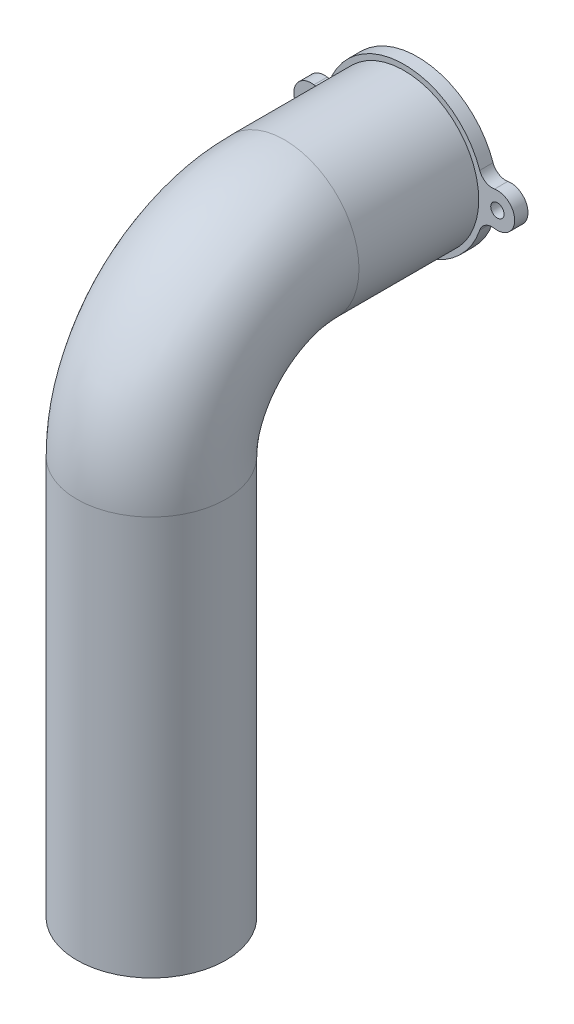
ISO-10303-21;
HEADER;
FILE_DESCRIPTION(('STEP AP214'),'2;1');
FILE_NAME('part.step','',(''),(''),'','','');
FILE_SCHEMA(('AUTOMOTIVE_DESIGN { 1 0 10303 214 1 1 1 1 }'));
ENDSEC;
DATA;
#1=APPLICATION_CONTEXT('core data for automotive mechanical design processes');
#2=APPLICATION_PROTOCOL_DEFINITION('international standard','automotive_design',2000,#1);
#3=PRODUCT_CONTEXT('',#1,'mechanical');
#4=PRODUCT('Part','Part','',(#3));
#5=PRODUCT_RELATED_PRODUCT_CATEGORY('part','',(#4));
#6=PRODUCT_DEFINITION_FORMATION('','',#4);
#7=PRODUCT_DEFINITION_CONTEXT('part definition',#1,'design');
#8=PRODUCT_DEFINITION('design','',#6,#7);
#9=PRODUCT_DEFINITION_SHAPE('','',#8);
#10=(LENGTH_UNIT() NAMED_UNIT(*) SI_UNIT(.MILLI.,.METRE.));
#11=(NAMED_UNIT(*) PLANE_ANGLE_UNIT() SI_UNIT($,.RADIAN.));
#12=(NAMED_UNIT(*) SI_UNIT($,.STERADIAN.) SOLID_ANGLE_UNIT());
#13=UNCERTAINTY_MEASURE_WITH_UNIT(LENGTH_MEASURE(1.E-05),#10,'distance_accuracy_value','');
#14=(GEOMETRIC_REPRESENTATION_CONTEXT(3) GLOBAL_UNCERTAINTY_ASSIGNED_CONTEXT((#13)) GLOBAL_UNIT_ASSIGNED_CONTEXT((#10,
#11,#12)) REPRESENTATION_CONTEXT('',''));
#15=CARTESIAN_POINT('',(0.,0.,0.));
#16=DIRECTION('',(0.,0.,1.));
#17=DIRECTION('',(1.,0.,0.));
#18=AXIS2_PLACEMENT_3D('',#15,#16,#17);
#19=CARTESIAN_POINT('',(0.,0.,5.));
#20=DIRECTION('',(0.,0.,1.));
#21=DIRECTION('',(1.,0.,0.));
#22=AXIS2_PLACEMENT_3D('',#19,#20,#21);
#23=PLANE('',#22);
#24=CARTESIAN_POINT('',(0.,0.,5.));
#25=DIRECTION('',(0.,0.,1.));
#26=DIRECTION('',(1.,0.,0.));
#27=AXIS2_PLACEMENT_3D('',#24,#25,#26);
#28=CIRCLE('',#27,28.);
#29=CARTESIAN_POINT('',(28.,0.,5.));
#30=VERTEX_POINT('',#29);
#31=EDGE_CURVE('E11',#30,#30,#28,.T.);
#32=ORIENTED_EDGE('',*,*,#31,.F.);
#33=EDGE_LOOP('',(#32));
#34=FACE_BOUND('',#33,.T.);
#35=CARTESIAN_POINT('',(33.1107142857143,11.3437471538198,5.));
#36=DIRECTION('',(0.,0.,1.));
#37=DIRECTION('',(1.,0.,0.));
#38=AXIS2_PLACEMENT_3D('',#35,#36,#37);
#39=CIRCLE('',#38,5.);
#40=CARTESIAN_POINT('',(28.380612244898,9.72321184613129,5.));
#41=VERTEX_POINT('',#40);
#42=CARTESIAN_POINT('',(33.9321428571429,6.41168317389816,5.));
#43=VERTEX_POINT('',#42);
#44=EDGE_CURVE('E138',#41,#43,#39,.T.);
#45=ORIENTED_EDGE('',*,*,#44,.F.);
#46=CARTESIAN_POINT('',(0.,0.,5.));
#47=DIRECTION('',(0.,0.,1.));
#48=DIRECTION('',(1.,0.,0.));
#49=AXIS2_PLACEMENT_3D('',#46,#47,#48);
#50=CIRCLE('',#49,30.);
#51=CARTESIAN_POINT('',(-28.380612244898,9.7232118461313,5.));
#52=VERTEX_POINT('',#51);
#53=EDGE_CURVE('E88',#41,#52,#50,.T.);
#54=ORIENTED_EDGE('',*,*,#53,.T.);
#55=CARTESIAN_POINT('',(-33.1107142857143,11.3437471538198,5.));
#56=DIRECTION('',(0.,0.,-1.));
#57=DIRECTION('',(-1.,0.,0.));
#58=AXIS2_PLACEMENT_3D('',#55,#56,#57);
#59=CIRCLE('',#58,5.);
#60=CARTESIAN_POINT('',(-33.9321428571429,6.41168317389817,5.));
#61=VERTEX_POINT('',#60);
#62=EDGE_CURVE('E167',#52,#61,#59,.T.);
#63=ORIENTED_EDGE('',*,*,#62,.T.);
#64=CARTESIAN_POINT('',(-35.,0.,5.));
#65=DIRECTION('',(0.,0.,1.));
#66=DIRECTION('',(1.,0.,0.));
#67=AXIS2_PLACEMENT_3D('',#64,#65,#66);
#68=CIRCLE('',#67,6.5);
#69=CARTESIAN_POINT('',(-33.9321428571429,-6.41168317389817,5.));
#70=VERTEX_POINT('',#69);
#71=EDGE_CURVE('E169',#61,#70,#68,.T.);
#72=ORIENTED_EDGE('',*,*,#71,.T.);
#73=CARTESIAN_POINT('',(-33.1107142857143,-11.3437471538198,5.));
#74=DIRECTION('',(0.,0.,-1.));
#75=DIRECTION('',(1.,0.,0.));
#76=AXIS2_PLACEMENT_3D('',#73,#74,#75);
#77=CIRCLE('',#76,5.);
#78=CARTESIAN_POINT('',(-28.380612244898,-9.72321184613129,5.));
#79=VERTEX_POINT('',#78);
#80=EDGE_CURVE('E57',#70,#79,#77,.T.);
#81=ORIENTED_EDGE('',*,*,#80,.T.);
#82=CARTESIAN_POINT('',(0.,0.,5.));
#83=DIRECTION('',(0.,0.,1.));
#84=DIRECTION('',(1.,0.,0.));
#85=AXIS2_PLACEMENT_3D('',#82,#83,#84);
#86=CIRCLE('',#85,30.);
#87=CARTESIAN_POINT('',(28.380612244898,-9.7232118461313,5.));
#88=VERTEX_POINT('',#87);
#89=EDGE_CURVE('E113',#79,#88,#86,.T.);
#90=ORIENTED_EDGE('',*,*,#89,.T.);
#91=CARTESIAN_POINT('',(33.1107142857143,-11.3437471538199,5.));
#92=DIRECTION('',(0.,0.,1.));
#93=DIRECTION('',(-1.,0.,0.));
#94=AXIS2_PLACEMENT_3D('',#91,#92,#93);
#95=CIRCLE('',#94,5.);
#96=CARTESIAN_POINT('',(33.9321428571429,-6.41168317389818,5.));
#97=VERTEX_POINT('',#96);
#98=EDGE_CURVE('E118',#97,#88,#95,.T.);
#99=ORIENTED_EDGE('',*,*,#98,.F.);
#100=CARTESIAN_POINT('',(35.,0.,5.));
#101=DIRECTION('',(0.,0.,-1.));
#102=DIRECTION('',(-1.,0.,0.));
#103=AXIS2_PLACEMENT_3D('',#100,#101,#102);
#104=CIRCLE('',#103,6.5);
#105=EDGE_CURVE('E135',#43,#97,#104,.T.);
#106=ORIENTED_EDGE('',*,*,#105,.F.);
#107=EDGE_LOOP('',(#45,#54,#63,#72,#81,#90,#99,#106));
#108=FACE_BOUND('',#107,.T.);
#109=CARTESIAN_POINT('',(-35.,0.,5.));
#110=DIRECTION('',(0.,0.,1.));
#111=DIRECTION('',(1.,0.,0.));
#112=AXIS2_PLACEMENT_3D('',#109,#110,#111);
#113=CIRCLE('',#112,2.5);
#114=CARTESIAN_POINT('',(-32.5,0.,5.));
#115=VERTEX_POINT('',#114);
#116=EDGE_CURVE('E160',#115,#115,#113,.T.);
#117=ORIENTED_EDGE('',*,*,#116,.F.);
#118=EDGE_LOOP('',(#117));
#119=FACE_BOUND('',#118,.T.);
#120=CARTESIAN_POINT('',(35.,0.,5.));
#121=DIRECTION('',(0.,0.,-1.));
#122=DIRECTION('',(-1.,0.,0.));
#123=AXIS2_PLACEMENT_3D('',#120,#121,#122);
#124=CIRCLE('',#123,2.5);
#125=CARTESIAN_POINT('',(32.5,0.,5.));
#126=VERTEX_POINT('',#125);
#127=EDGE_CURVE('E152',#126,#126,#124,.T.);
#128=ORIENTED_EDGE('',*,*,#127,.T.);
#129=EDGE_LOOP('',(#128));
#130=FACE_BOUND('',#129,.T.);
#131=ADVANCED_FACE('F39',(#34,#108,#119,#130),#23,.T.);
#132=CARTESIAN_POINT('',(0.,0.,0.));
#133=DIRECTION('',(0.,0.,1.));
#134=DIRECTION('',(1.,0.,0.));
#135=AXIS2_PLACEMENT_3D('',#132,#133,#134);
#136=PLANE('',#135);
#137=CARTESIAN_POINT('',(0.,0.,0.));
#138=DIRECTION('',(0.,0.,1.));
#139=DIRECTION('',(1.,0.,0.));
#140=AXIS2_PLACEMENT_3D('',#137,#138,#139);
#141=CIRCLE('',#140,30.);
#142=CARTESIAN_POINT('',(28.380612244898,9.72321184613129,0.));
#143=VERTEX_POINT('',#142);
#144=CARTESIAN_POINT('',(-28.380612244898,9.7232118461313,0.));
#145=VERTEX_POINT('',#144);
#146=EDGE_CURVE('E174',#143,#145,#141,.T.);
#147=ORIENTED_EDGE('',*,*,#146,.F.);
#148=CARTESIAN_POINT('',(33.1107142857143,11.3437471538198,0.));
#149=DIRECTION('',(0.,0.,1.));
#150=DIRECTION('',(1.,0.,0.));
#151=AXIS2_PLACEMENT_3D('',#148,#149,#150);
#152=CIRCLE('',#151,5.);
#153=CARTESIAN_POINT('',(33.9321428571429,6.41168317389816,0.));
#154=VERTEX_POINT('',#153);
#155=EDGE_CURVE('E136',#143,#154,#152,.T.);
#156=ORIENTED_EDGE('',*,*,#155,.T.);
#157=CARTESIAN_POINT('',(35.,0.,0.));
#158=DIRECTION('',(0.,0.,-1.));
#159=DIRECTION('',(-1.,0.,0.));
#160=AXIS2_PLACEMENT_3D('',#157,#158,#159);
#161=CIRCLE('',#160,6.5);
#162=CARTESIAN_POINT('',(33.9321428571429,-6.41168317389818,0.));
#163=VERTEX_POINT('',#162);
#164=EDGE_CURVE('E141',#154,#163,#161,.T.);
#165=ORIENTED_EDGE('',*,*,#164,.T.);
#166=CARTESIAN_POINT('',(33.1107142857143,-11.3437471538199,0.));
#167=DIRECTION('',(0.,0.,1.));
#168=DIRECTION('',(-1.,0.,0.));
#169=AXIS2_PLACEMENT_3D('',#166,#167,#168);
#170=CIRCLE('',#169,5.);
#171=CARTESIAN_POINT('',(28.380612244898,-9.7232118461313,0.));
#172=VERTEX_POINT('',#171);
#173=EDGE_CURVE('E150',#163,#172,#170,.T.);
#174=ORIENTED_EDGE('',*,*,#173,.T.);
#175=CARTESIAN_POINT('',(0.,0.,0.));
#176=DIRECTION('',(0.,0.,1.));
#177=DIRECTION('',(1.,0.,0.));
#178=AXIS2_PLACEMENT_3D('',#175,#176,#177);
#179=CIRCLE('',#178,30.);
#180=CARTESIAN_POINT('',(-28.380612244898,-9.72321184613129,0.));
#181=VERTEX_POINT('',#180);
#182=EDGE_CURVE('E127',#181,#172,#179,.T.);
#183=ORIENTED_EDGE('',*,*,#182,.F.);
#184=CARTESIAN_POINT('',(-33.1107142857143,-11.3437471538198,0.));
#185=DIRECTION('',(0.,0.,-1.));
#186=DIRECTION('',(1.,0.,0.));
#187=AXIS2_PLACEMENT_3D('',#184,#185,#186);
#188=CIRCLE('',#187,5.);
#189=CARTESIAN_POINT('',(-33.9321428571429,-6.41168317389817,0.));
#190=VERTEX_POINT('',#189);
#191=EDGE_CURVE('E81',#190,#181,#188,.T.);
#192=ORIENTED_EDGE('',*,*,#191,.F.);
#193=CARTESIAN_POINT('',(-35.,0.,0.));
#194=DIRECTION('',(0.,0.,1.));
#195=DIRECTION('',(1.,0.,0.));
#196=AXIS2_PLACEMENT_3D('',#193,#194,#195);
#197=CIRCLE('',#196,6.5);
#198=CARTESIAN_POINT('',(-33.9321428571429,6.41168317389817,0.));
#199=VERTEX_POINT('',#198);
#200=EDGE_CURVE('E75',#199,#190,#197,.T.);
#201=ORIENTED_EDGE('',*,*,#200,.F.);
#202=CARTESIAN_POINT('',(-33.1107142857143,11.3437471538198,0.));
#203=DIRECTION('',(0.,0.,-1.));
#204=DIRECTION('',(-1.,0.,0.));
#205=AXIS2_PLACEMENT_3D('',#202,#203,#204);
#206=CIRCLE('',#205,5.);
#207=EDGE_CURVE('E176',#145,#199,#206,.T.);
#208=ORIENTED_EDGE('',*,*,#207,.F.);
#209=EDGE_LOOP('',(#147,#156,#165,#174,#183,#192,#201,#208));
#210=FACE_BOUND('',#209,.T.);
#211=CARTESIAN_POINT('',(0.,0.,0.));
#212=DIRECTION('',(0.,0.,-1.));
#213=DIRECTION('',(1.,0.,0.));
#214=AXIS2_PLACEMENT_3D('',#211,#212,#213);
#215=CIRCLE('',#214,26.);
#216=CARTESIAN_POINT('',(26.,0.,0.));
#217=VERTEX_POINT('',#216);
#218=EDGE_CURVE('E163',#217,#217,#215,.T.);
#219=ORIENTED_EDGE('',*,*,#218,.F.);
#220=EDGE_LOOP('',(#219));
#221=FACE_BOUND('',#220,.T.);
#222=CARTESIAN_POINT('',(-35.,0.,0.));
#223=DIRECTION('',(0.,0.,1.));
#224=DIRECTION('',(1.,0.,0.));
#225=AXIS2_PLACEMENT_3D('',#222,#223,#224);
#226=CIRCLE('',#225,2.5);
#227=CARTESIAN_POINT('',(-32.5,0.,0.));
#228=VERTEX_POINT('',#227);
#229=EDGE_CURVE('E131',#228,#228,#226,.T.);
#230=ORIENTED_EDGE('',*,*,#229,.T.);
#231=EDGE_LOOP('',(#230));
#232=FACE_BOUND('',#231,.T.);
#233=CARTESIAN_POINT('',(35.,0.,0.));
#234=DIRECTION('',(0.,0.,-1.));
#235=DIRECTION('',(-1.,0.,0.));
#236=AXIS2_PLACEMENT_3D('',#233,#234,#235);
#237=CIRCLE('',#236,2.5);
#238=CARTESIAN_POINT('',(32.5,0.,0.));
#239=VERTEX_POINT('',#238);
#240=EDGE_CURVE('E144',#239,#239,#237,.T.);
#241=ORIENTED_EDGE('',*,*,#240,.F.);
#242=EDGE_LOOP('',(#241));
#243=FACE_BOUND('',#242,.T.);
#244=ADVANCED_FACE('F193',(#210,#221,#232,#243),#136,.F.);
#245=CARTESIAN_POINT('',(0.,0.,5.));
#246=DIRECTION('',(0.,0.,-1.));
#247=DIRECTION('',(-1.,0.,0.));
#248=AXIS2_PLACEMENT_3D('',#245,#246,#247);
#249=CYLINDRICAL_SURFACE('',#248,26.);
#250=ORIENTED_EDGE('',*,*,#218,.T.);
#251=EDGE_LOOP('',(#250));
#252=FACE_BOUND('',#251,.T.);
#253=CARTESIAN_POINT('',(0.,0.,50.));
#254=DIRECTION('',(0.,0.,1.));
#255=DIRECTION('',(1.,0.,0.));
#256=AXIS2_PLACEMENT_3D('',#253,#254,#255);
#257=CIRCLE('',#256,26.);
#258=CARTESIAN_POINT('',(0.,26.,50.));
#259=VERTEX_POINT('',#258);
#260=EDGE_CURVE('E384',#259,#259,#257,.F.);
#261=ORIENTED_EDGE('',*,*,#260,.F.);
#262=EDGE_LOOP('',(#261));
#263=FACE_BOUND('',#262,.T.);
#264=ADVANCED_FACE('F41',(#252,#263),#249,.F.);
#265=CARTESIAN_POINT('',(0.,0.,5.));
#266=DIRECTION('',(0.,0.,-1.));
#267=DIRECTION('',(-1.,0.,0.));
#268=AXIS2_PLACEMENT_3D('',#265,#266,#267);
#269=CYLINDRICAL_SURFACE('',#268,30.);
#270=ORIENTED_EDGE('',*,*,#146,.T.);
#271=DIRECTION('',(0.,0.,-1.));
#272=VECTOR('',#271,1.);
#273=CARTESIAN_POINT('',(-28.380612244898,9.7232118461313,5.));
#274=LINE('',#273,#272);
#275=EDGE_CURVE('E43',#52,#145,#274,.T.);
#276=ORIENTED_EDGE('',*,*,#275,.F.);
#277=ORIENTED_EDGE('',*,*,#53,.F.);
#278=DIRECTION('',(0.,0.,-1.));
#279=VECTOR('',#278,1.);
#280=CARTESIAN_POINT('',(28.380612244898,9.72321184613129,5.));
#281=LINE('',#280,#279);
#282=EDGE_CURVE('E149',#41,#143,#281,.T.);
#283=ORIENTED_EDGE('',*,*,#282,.T.);
#284=EDGE_LOOP('',(#270,#276,#277,#283));
#285=FACE_BOUND('',#284,.T.);
#286=ADVANCED_FACE('F202',(#285),#269,.T.);
#287=CARTESIAN_POINT('',(-33.1107142857143,11.3437471538198,5.));
#288=DIRECTION('',(0.,0.,-1.));
#289=DIRECTION('',(-1.,0.,0.));
#290=AXIS2_PLACEMENT_3D('',#287,#288,#289);
#291=CYLINDRICAL_SURFACE('',#290,5.);
#292=ORIENTED_EDGE('',*,*,#207,.T.);
#293=DIRECTION('',(0.,0.,-1.));
#294=VECTOR('',#293,1.);
#295=CARTESIAN_POINT('',(-33.9321428571429,6.41168317389817,5.));
#296=LINE('',#295,#294);
#297=EDGE_CURVE('E183',#61,#199,#296,.T.);
#298=ORIENTED_EDGE('',*,*,#297,.F.);
#299=ORIENTED_EDGE('',*,*,#62,.F.);
#300=ORIENTED_EDGE('',*,*,#275,.T.);
#301=EDGE_LOOP('',(#292,#298,#299,#300));
#302=FACE_BOUND('',#301,.T.);
#303=ADVANCED_FACE('F190',(#302),#291,.F.);
#304=CARTESIAN_POINT('',(-35.,0.,5.));
#305=DIRECTION('',(0.,0.,-1.));
#306=DIRECTION('',(-1.,0.,0.));
#307=AXIS2_PLACEMENT_3D('',#304,#305,#306);
#308=CYLINDRICAL_SURFACE('',#307,6.5);
#309=ORIENTED_EDGE('',*,*,#200,.T.);
#310=DIRECTION('',(0.,0.,-1.));
#311=VECTOR('',#310,1.);
#312=CARTESIAN_POINT('',(-33.9321428571429,-6.41168317389817,5.));
#313=LINE('',#312,#311);
#314=EDGE_CURVE('E182',#70,#190,#313,.T.);
#315=ORIENTED_EDGE('',*,*,#314,.F.);
#316=ORIENTED_EDGE('',*,*,#71,.F.);
#317=ORIENTED_EDGE('',*,*,#297,.T.);
#318=EDGE_LOOP('',(#309,#315,#316,#317));
#319=FACE_BOUND('',#318,.T.);
#320=ADVANCED_FACE('F209',(#319),#308,.T.);
#321=CARTESIAN_POINT('',(-33.1107142857143,-11.3437471538198,5.));
#322=DIRECTION('',(0.,0.,-1.));
#323=DIRECTION('',(-1.,0.,0.));
#324=AXIS2_PLACEMENT_3D('',#321,#322,#323);
#325=CYLINDRICAL_SURFACE('',#324,5.);
#326=ORIENTED_EDGE('',*,*,#191,.T.);
#327=DIRECTION('',(0.,0.,-1.));
#328=VECTOR('',#327,1.);
#329=CARTESIAN_POINT('',(-28.380612244898,-9.72321184613129,5.));
#330=LINE('',#329,#328);
#331=EDGE_CURVE('E121',#79,#181,#330,.T.);
#332=ORIENTED_EDGE('',*,*,#331,.F.);
#333=ORIENTED_EDGE('',*,*,#80,.F.);
#334=ORIENTED_EDGE('',*,*,#314,.T.);
#335=EDGE_LOOP('',(#326,#332,#333,#334));
#336=FACE_BOUND('',#335,.T.);
#337=ADVANCED_FACE('F226',(#336),#325,.F.);
#338=CARTESIAN_POINT('',(0.,0.,5.));
#339=DIRECTION('',(0.,0.,-1.));
#340=DIRECTION('',(-1.,0.,0.));
#341=AXIS2_PLACEMENT_3D('',#338,#339,#340);
#342=CYLINDRICAL_SURFACE('',#341,30.);
#343=ORIENTED_EDGE('',*,*,#182,.T.);
#344=DIRECTION('',(0.,0.,-1.));
#345=VECTOR('',#344,1.);
#346=CARTESIAN_POINT('',(28.380612244898,-9.7232118461313,5.));
#347=LINE('',#346,#345);
#348=EDGE_CURVE('E124',#88,#172,#347,.T.);
#349=ORIENTED_EDGE('',*,*,#348,.F.);
#350=ORIENTED_EDGE('',*,*,#89,.F.);
#351=ORIENTED_EDGE('',*,*,#331,.T.);
#352=EDGE_LOOP('',(#343,#349,#350,#351));
#353=FACE_BOUND('',#352,.T.);
#354=ADVANCED_FACE('F125',(#353),#342,.T.);
#355=CARTESIAN_POINT('',(-35.,0.,5.));
#356=DIRECTION('',(0.,0.,-1.));
#357=DIRECTION('',(-1.,0.,0.));
#358=AXIS2_PLACEMENT_3D('',#355,#356,#357);
#359=CYLINDRICAL_SURFACE('',#358,2.5);
#360=ORIENTED_EDGE('',*,*,#116,.T.);
#361=EDGE_LOOP('',(#360));
#362=FACE_BOUND('',#361,.T.);
#363=ORIENTED_EDGE('',*,*,#229,.F.);
#364=EDGE_LOOP('',(#363));
#365=FACE_BOUND('',#364,.T.);
#366=ADVANCED_FACE('F222',(#362,#365),#359,.F.);
#367=CARTESIAN_POINT('',(33.1107142857143,-11.3437471538199,5.));
#368=DIRECTION('',(0.,0.,-1.));
#369=DIRECTION('',(-1.,0.,0.));
#370=AXIS2_PLACEMENT_3D('',#367,#368,#369);
#371=CYLINDRICAL_SURFACE('',#370,5.);
#372=ORIENTED_EDGE('',*,*,#173,.F.);
#373=DIRECTION('',(0.,0.,-1.));
#374=VECTOR('',#373,1.);
#375=CARTESIAN_POINT('',(33.9321428571429,-6.41168317389818,5.));
#376=LINE('',#375,#374);
#377=EDGE_CURVE('E132',#97,#163,#376,.T.);
#378=ORIENTED_EDGE('',*,*,#377,.F.);
#379=ORIENTED_EDGE('',*,*,#98,.T.);
#380=ORIENTED_EDGE('',*,*,#348,.T.);
#381=EDGE_LOOP('',(#372,#378,#379,#380));
#382=FACE_BOUND('',#381,.T.);
#383=ADVANCED_FACE('F134',(#382),#371,.F.);
#384=CARTESIAN_POINT('',(35.,0.,5.));
#385=DIRECTION('',(0.,0.,-1.));
#386=DIRECTION('',(-1.,0.,0.));
#387=AXIS2_PLACEMENT_3D('',#384,#385,#386);
#388=CYLINDRICAL_SURFACE('',#387,6.5);
#389=ORIENTED_EDGE('',*,*,#164,.F.);
#390=DIRECTION('',(0.,0.,-1.));
#391=VECTOR('',#390,1.);
#392=CARTESIAN_POINT('',(33.9321428571429,6.41168317389816,5.));
#393=LINE('',#392,#391);
#394=EDGE_CURVE('E157',#43,#154,#393,.T.);
#395=ORIENTED_EDGE('',*,*,#394,.F.);
#396=ORIENTED_EDGE('',*,*,#105,.T.);
#397=ORIENTED_EDGE('',*,*,#377,.T.);
#398=EDGE_LOOP('',(#389,#395,#396,#397));
#399=FACE_BOUND('',#398,.T.);
#400=ADVANCED_FACE('F198',(#399),#388,.T.);
#401=CARTESIAN_POINT('',(33.1107142857143,11.3437471538198,5.));
#402=DIRECTION('',(0.,0.,-1.));
#403=DIRECTION('',(-1.,0.,0.));
#404=AXIS2_PLACEMENT_3D('',#401,#402,#403);
#405=CYLINDRICAL_SURFACE('',#404,5.);
#406=ORIENTED_EDGE('',*,*,#155,.F.);
#407=ORIENTED_EDGE('',*,*,#282,.F.);
#408=ORIENTED_EDGE('',*,*,#44,.T.);
#409=ORIENTED_EDGE('',*,*,#394,.T.);
#410=EDGE_LOOP('',(#406,#407,#408,#409));
#411=FACE_BOUND('',#410,.T.);
#412=ADVANCED_FACE('F201',(#411),#405,.F.);
#413=CARTESIAN_POINT('',(35.,0.,5.));
#414=DIRECTION('',(0.,0.,-1.));
#415=DIRECTION('',(-1.,0.,0.));
#416=AXIS2_PLACEMENT_3D('',#413,#414,#415);
#417=CYLINDRICAL_SURFACE('',#416,2.5);
#418=ORIENTED_EDGE('',*,*,#127,.F.);
#419=EDGE_LOOP('',(#418));
#420=FACE_BOUND('',#419,.T.);
#421=ORIENTED_EDGE('',*,*,#240,.T.);
#422=EDGE_LOOP('',(#421));
#423=FACE_BOUND('',#422,.T.);
#424=ADVANCED_FACE('F306',(#420,#423),#417,.F.);
#425=CARTESIAN_POINT('',(0.,0.,5.));
#426=DIRECTION('',(0.,0.,1.));
#427=DIRECTION('',(0.,-1.,0.));
#428=AXIS2_PLACEMENT_3D('',#425,#426,#427);
#429=CYLINDRICAL_SURFACE('',#428,28.);
#430=CARTESIAN_POINT('',(0.,0.,50.));
#431=DIRECTION('',(0.,0.,1.));
#432=DIRECTION('',(1.,0.,0.));
#433=AXIS2_PLACEMENT_3D('',#430,#431,#432);
#434=CIRCLE('',#433,28.);
#435=CARTESIAN_POINT('',(0.,28.,50.));
#436=VERTEX_POINT('',#435);
#437=EDGE_CURVE('E394',#436,#436,#434,.T.);
#438=ORIENTED_EDGE('',*,*,#437,.F.);
#439=EDGE_LOOP('',(#438));
#440=FACE_BOUND('',#439,.T.);
#441=ORIENTED_EDGE('',*,*,#31,.T.);
#442=EDGE_LOOP('',(#441));
#443=FACE_BOUND('',#442,.T.);
#444=ADVANCED_FACE('F313',(#440,#443),#429,.T.);
#445=CARTESIAN_POINT('',(0.,-50.,50.));
#446=DIRECTION('',(1.,0.,0.));
#447=DIRECTION('',(0.,0.,-1.));
#448=AXIS2_PLACEMENT_3D('',#445,#446,#447);
#449=TOROIDAL_SURFACE('',#448,50.,28.);
#450=CARTESIAN_POINT('',(0.,-50.,100.));
#451=DIRECTION('',(0.,-1.,0.));
#452=DIRECTION('',(1.,0.,0.));
#453=AXIS2_PLACEMENT_3D('',#450,#451,#452);
#454=CIRCLE('',#453,28.);
#455=CARTESIAN_POINT('',(0.,-50.,128.));
#456=VERTEX_POINT('',#455);
#457=EDGE_CURVE('E392',#456,#456,#454,.T.);
#458=CARTESIAN_POINT('',(0.,-50.,50.));
#459=DIRECTION('',(1.,0.,0.));
#460=DIRECTION('',(0.,0.,-1.));
#461=AXIS2_PLACEMENT_3D('',#458,#459,#460);
#462=CIRCLE('',#461,78.);
#463=EDGE_CURVE('',#436,#456,#462,.T.);
#464=ORIENTED_EDGE('',*,*,#437,.T.);
#465=ORIENTED_EDGE('',*,*,#457,.F.);
#466=ORIENTED_EDGE('',*,*,#463,.T.);
#467=ORIENTED_EDGE('',*,*,#463,.F.);
#468=EDGE_LOOP('',(#464,#466,#465,#467));
#469=FACE_BOUND('',#468,.T.);
#470=ADVANCED_FACE('F323',(#469),#449,.T.);
#471=CARTESIAN_POINT('',(0.,-50.,100.));
#472=DIRECTION('',(0.,-1.,0.));
#473=DIRECTION('',(0.,0.,-1.));
#474=AXIS2_PLACEMENT_3D('',#471,#472,#473);
#475=CYLINDRICAL_SURFACE('',#474,28.);
#476=CARTESIAN_POINT('',(0.,-200.,100.));
#477=DIRECTION('',(0.,-1.,0.));
#478=DIRECTION('',(1.,0.,0.));
#479=AXIS2_PLACEMENT_3D('',#476,#477,#478);
#480=CIRCLE('',#479,28.);
#481=CARTESIAN_POINT('',(28.,-200.,100.));
#482=VERTEX_POINT('',#481);
#483=EDGE_CURVE('E388',#482,#482,#480,.T.);
#484=ORIENTED_EDGE('',*,*,#483,.F.);
#485=EDGE_LOOP('',(#484));
#486=FACE_BOUND('',#485,.T.);
#487=ORIENTED_EDGE('',*,*,#457,.T.);
#488=EDGE_LOOP('',(#487));
#489=FACE_BOUND('',#488,.T.);
#490=ADVANCED_FACE('F332',(#486,#489),#475,.T.);
#491=CARTESIAN_POINT('',(0.,-200.,100.));
#492=DIRECTION('',(0.,-1.,0.));
#493=DIRECTION('',(1.,0.,0.));
#494=AXIS2_PLACEMENT_3D('',#491,#492,#493);
#495=PLANE('',#494);
#496=CARTESIAN_POINT('',(0.,-200.,100.));
#497=DIRECTION('',(0.,-1.,0.));
#498=DIRECTION('',(1.,0.,0.));
#499=AXIS2_PLACEMENT_3D('',#496,#497,#498);
#500=CIRCLE('',#499,26.);
#501=CARTESIAN_POINT('',(26.,-200.,100.));
#502=VERTEX_POINT('',#501);
#503=EDGE_CURVE('E380',#502,#502,#500,.F.);
#504=ORIENTED_EDGE('',*,*,#503,.T.);
#505=EDGE_LOOP('',(#504));
#506=FACE_BOUND('',#505,.T.);
#507=ORIENTED_EDGE('',*,*,#483,.T.);
#508=EDGE_LOOP('',(#507));
#509=FACE_BOUND('',#508,.T.);
#510=ADVANCED_FACE('F341',(#506,#509),#495,.T.);
#511=CARTESIAN_POINT('',(0.,-50.,50.));
#512=DIRECTION('',(1.,0.,0.));
#513=DIRECTION('',(0.,0.,-1.));
#514=AXIS2_PLACEMENT_3D('',#511,#512,#513);
#515=TOROIDAL_SURFACE('',#514,50.,26.);
#516=CARTESIAN_POINT('',(0.,-50.,100.));
#517=DIRECTION('',(0.,-1.,0.));
#518=DIRECTION('',(1.,0.,0.));
#519=AXIS2_PLACEMENT_3D('',#516,#517,#518);
#520=CIRCLE('',#519,26.);
#521=CARTESIAN_POINT('',(0.,-50.,126.));
#522=VERTEX_POINT('',#521);
#523=EDGE_CURVE('E383',#522,#522,#520,.F.);
#524=CARTESIAN_POINT('',(0.,-50.,50.));
#525=DIRECTION('',(1.,0.,0.));
#526=DIRECTION('',(0.,0.,-1.));
#527=AXIS2_PLACEMENT_3D('',#524,#525,#526);
#528=CIRCLE('',#527,76.);
#529=EDGE_CURVE('',#259,#522,#528,.T.);
#530=ORIENTED_EDGE('',*,*,#260,.T.);
#531=ORIENTED_EDGE('',*,*,#523,.F.);
#532=ORIENTED_EDGE('',*,*,#529,.T.);
#533=ORIENTED_EDGE('',*,*,#529,.F.);
#534=EDGE_LOOP('',(#530,#532,#531,#533));
#535=FACE_BOUND('',#534,.T.);
#536=ADVANCED_FACE('F350',(#535),#515,.F.);
#537=CARTESIAN_POINT('',(0.,-50.,100.));
#538=DIRECTION('',(0.,-1.,0.));
#539=DIRECTION('',(0.,0.,-1.));
#540=AXIS2_PLACEMENT_3D('',#537,#538,#539);
#541=CYLINDRICAL_SURFACE('',#540,26.);
#542=ORIENTED_EDGE('',*,*,#503,.F.);
#543=EDGE_LOOP('',(#542));
#544=FACE_BOUND('',#543,.T.);
#545=ORIENTED_EDGE('',*,*,#523,.T.);
#546=EDGE_LOOP('',(#545));
#547=FACE_BOUND('',#546,.T.);
#548=ADVANCED_FACE('F316',(#544,#547),#541,.F.);
#549=CLOSED_SHELL('',(#131,#244,#264,#286,#303,#320,#337,#354,#366,#383,#400,#412,#424,#444,
#470,#490,#510,#536,#548));
#550=MANIFOLD_SOLID_BREP('B2',#549);
#551=ADVANCED_BREP_SHAPE_REPRESENTATION('',(#18,#550),#14);
#552=SHAPE_DEFINITION_REPRESENTATION(#9,#551);
ENDSEC;
END-ISO-10303-21;
